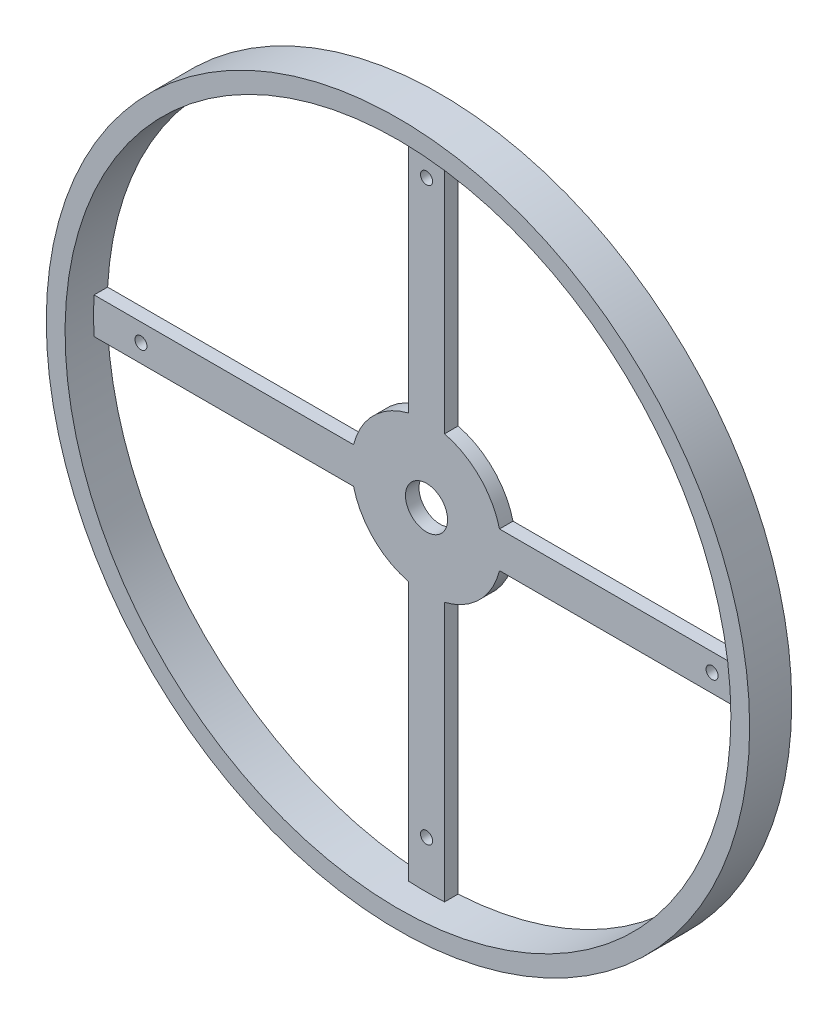
ISO-10303-21;
HEADER;
FILE_DESCRIPTION(('STEP AP214'),'2;1');
FILE_NAME('part.step','',(''),(''),'','','');
FILE_SCHEMA(('AUTOMOTIVE_DESIGN { 1 0 10303 214 1 1 1 1 }'));
ENDSEC;
DATA;
#1=APPLICATION_CONTEXT('core data for automotive mechanical design processes');
#2=APPLICATION_PROTOCOL_DEFINITION('international standard','automotive_design',2000,#1);
#3=PRODUCT_CONTEXT('',#1,'mechanical');
#4=PRODUCT('Part','Part','',(#3));
#5=PRODUCT_RELATED_PRODUCT_CATEGORY('part','',(#4));
#6=PRODUCT_DEFINITION_FORMATION('','',#4);
#7=PRODUCT_DEFINITION_CONTEXT('part definition',#1,'design');
#8=PRODUCT_DEFINITION('design','',#6,#7);
#9=PRODUCT_DEFINITION_SHAPE('','',#8);
#10=(LENGTH_UNIT() NAMED_UNIT(*) SI_UNIT(.MILLI.,.METRE.));
#11=(NAMED_UNIT(*) PLANE_ANGLE_UNIT() SI_UNIT($,.RADIAN.));
#12=(NAMED_UNIT(*) SI_UNIT($,.STERADIAN.) SOLID_ANGLE_UNIT());
#13=UNCERTAINTY_MEASURE_WITH_UNIT(LENGTH_MEASURE(1.E-05),#10,'distance_accuracy_value','');
#14=(GEOMETRIC_REPRESENTATION_CONTEXT(3) GLOBAL_UNCERTAINTY_ASSIGNED_CONTEXT((#13)) GLOBAL_UNIT_ASSIGNED_CONTEXT((#10,
#11,#12)) REPRESENTATION_CONTEXT('',''));
#15=CARTESIAN_POINT('',(0.,0.,0.));
#16=DIRECTION('',(0.,0.,1.));
#17=DIRECTION('',(1.,0.,0.));
#18=AXIS2_PLACEMENT_3D('',#15,#16,#17);
#19=CARTESIAN_POINT('',(0.,0.,1.4));
#20=DIRECTION('',(0.,0.,-1.));
#21=DIRECTION('',(-1.,0.,0.));
#22=AXIS2_PLACEMENT_3D('',#19,#20,#21);
#23=CYLINDRICAL_SURFACE('',#22,11.075);
#24=DIRECTION('',(0.,0.,-1.));
#25=VECTOR('',#24,1.);
#26=CARTESIAN_POINT('',(0.6,11.0587352350981,0.45));
#27=LINE('',#26,#25);
#28=CARTESIAN_POINT('',(0.6,11.0587352350981,0.45));
#29=VERTEX_POINT('',#28);
#30=CARTESIAN_POINT('',(0.6,11.0587352350981,0.));
#31=VERTEX_POINT('',#30);
#32=EDGE_CURVE('E150',#29,#31,#27,.T.);
#33=ORIENTED_EDGE('',*,*,#32,.T.);
#34=CARTESIAN_POINT('',(0.,0.,0.));
#35=DIRECTION('',(0.,0.,1.));
#36=DIRECTION('',(1.,0.,0.));
#37=AXIS2_PLACEMENT_3D('',#34,#35,#36);
#38=CIRCLE('',#37,11.075);
#39=CARTESIAN_POINT('',(11.0587352350981,0.599999999999962,0.));
#40=VERTEX_POINT('',#39);
#41=EDGE_CURVE('E300',#40,#31,#38,.T.);
#42=ORIENTED_EDGE('',*,*,#41,.F.);
#43=DIRECTION('',(0.,0.,-1.));
#44=VECTOR('',#43,1.);
#45=CARTESIAN_POINT('',(11.0587352350981,0.599999999999962,0.45));
#46=LINE('',#45,#44);
#47=CARTESIAN_POINT('',(11.0587352350981,0.599999999999962,0.45));
#48=VERTEX_POINT('',#47);
#49=EDGE_CURVE('E270',#48,#40,#46,.T.);
#50=ORIENTED_EDGE('',*,*,#49,.F.);
#51=CARTESIAN_POINT('',(0.,0.,0.45));
#52=DIRECTION('',(0.,0.,1.));
#53=DIRECTION('',(1.,0.,0.));
#54=AXIS2_PLACEMENT_3D('',#51,#52,#53);
#55=CIRCLE('',#54,11.075);
#56=CARTESIAN_POINT('',(11.0587352350981,-0.600000000000038,0.45));
#57=VERTEX_POINT('',#56);
#58=EDGE_CURVE('E207',#57,#48,#55,.T.);
#59=ORIENTED_EDGE('',*,*,#58,.F.);
#60=DIRECTION('',(0.,0.,-1.));
#61=VECTOR('',#60,1.);
#62=CARTESIAN_POINT('',(11.0587352350981,-0.600000000000038,0.45));
#63=LINE('',#62,#61);
#64=CARTESIAN_POINT('',(11.0587352350981,-0.600000000000038,0.));
#65=VERTEX_POINT('',#64);
#66=EDGE_CURVE('E272',#57,#65,#63,.T.);
#67=ORIENTED_EDGE('',*,*,#66,.T.);
#68=CARTESIAN_POINT('',(0.599999999999923,-11.0587352350981,0.));
#69=VERTEX_POINT('',#68);
#70=EDGE_CURVE('E160',#69,#65,#38,.T.);
#71=ORIENTED_EDGE('',*,*,#70,.F.);
#72=DIRECTION('',(0.,0.,-1.));
#73=VECTOR('',#72,1.);
#74=CARTESIAN_POINT('',(0.599999999999923,-11.0587352350981,0.45));
#75=LINE('',#74,#73);
#76=CARTESIAN_POINT('',(0.599999999999923,-11.0587352350981,0.45));
#77=VERTEX_POINT('',#76);
#78=EDGE_CURVE('E50',#77,#69,#75,.T.);
#79=ORIENTED_EDGE('',*,*,#78,.F.);
#80=CARTESIAN_POINT('',(0.,0.,0.45));
#81=DIRECTION('',(0.,0.,1.));
#82=DIRECTION('',(1.,0.,0.));
#83=AXIS2_PLACEMENT_3D('',#80,#81,#82);
#84=CIRCLE('',#83,11.075);
#85=CARTESIAN_POINT('',(-0.600000000000077,-11.0587352350981,0.45));
#86=VERTEX_POINT('',#85);
#87=EDGE_CURVE('E197',#86,#77,#84,.T.);
#88=ORIENTED_EDGE('',*,*,#87,.F.);
#89=DIRECTION('',(0.,0.,-1.));
#90=VECTOR('',#89,1.);
#91=CARTESIAN_POINT('',(-0.600000000000077,-11.0587352350981,0.45));
#92=LINE('',#91,#90);
#93=CARTESIAN_POINT('',(-0.600000000000077,-11.0587352350981,0.));
#94=VERTEX_POINT('',#93);
#95=EDGE_CURVE('E281',#86,#94,#92,.T.);
#96=ORIENTED_EDGE('',*,*,#95,.T.);
#97=CARTESIAN_POINT('',(-11.0587352350981,-0.599999999999885,0.));
#98=VERTEX_POINT('',#97);
#99=EDGE_CURVE('E306',#98,#94,#38,.T.);
#100=ORIENTED_EDGE('',*,*,#99,.F.);
#101=DIRECTION('',(0.,0.,-1.));
#102=VECTOR('',#101,1.);
#103=CARTESIAN_POINT('',(-11.0587352350981,-0.599999999999885,0.45));
#104=LINE('',#103,#102);
#105=CARTESIAN_POINT('',(-11.0587352350981,-0.599999999999885,0.45));
#106=VERTEX_POINT('',#105);
#107=EDGE_CURVE('E58',#106,#98,#104,.T.);
#108=ORIENTED_EDGE('',*,*,#107,.F.);
#109=CARTESIAN_POINT('',(0.,0.,0.45));
#110=DIRECTION('',(0.,0.,1.));
#111=DIRECTION('',(1.,0.,0.));
#112=AXIS2_PLACEMENT_3D('',#109,#110,#111);
#113=CIRCLE('',#112,11.075);
#114=CARTESIAN_POINT('',(-11.0587352350981,0.600000000000116,0.45));
#115=VERTEX_POINT('',#114);
#116=EDGE_CURVE('E188',#115,#106,#113,.T.);
#117=ORIENTED_EDGE('',*,*,#116,.F.);
#118=DIRECTION('',(0.,0.,-1.));
#119=VECTOR('',#118,1.);
#120=CARTESIAN_POINT('',(-11.0587352350981,0.600000000000116,0.45));
#121=LINE('',#120,#119);
#122=CARTESIAN_POINT('',(-11.0587352350981,0.600000000000116,0.));
#123=VERTEX_POINT('',#122);
#124=EDGE_CURVE('E290',#115,#123,#121,.T.);
#125=ORIENTED_EDGE('',*,*,#124,.T.);
#126=CARTESIAN_POINT('',(-0.6,11.0587352350981,0.));
#127=VERTEX_POINT('',#126);
#128=EDGE_CURVE('E301',#127,#123,#38,.T.);
#129=ORIENTED_EDGE('',*,*,#128,.F.);
#130=DIRECTION('',(0.,0.,-1.));
#131=VECTOR('',#130,1.);
#132=CARTESIAN_POINT('',(-0.6,11.0587352350981,0.45));
#133=LINE('',#132,#131);
#134=CARTESIAN_POINT('',(-0.6,11.0587352350981,0.45));
#135=VERTEX_POINT('',#134);
#136=EDGE_CURVE('E161',#135,#127,#133,.T.);
#137=ORIENTED_EDGE('',*,*,#136,.F.);
#138=CARTESIAN_POINT('',(0.,0.,0.45));
#139=DIRECTION('',(0.,0.,1.));
#140=DIRECTION('',(1.,0.,0.));
#141=AXIS2_PLACEMENT_3D('',#138,#139,#140);
#142=CIRCLE('',#141,11.075);
#143=EDGE_CURVE('E168',#29,#135,#142,.T.);
#144=ORIENTED_EDGE('',*,*,#143,.F.);
#145=EDGE_LOOP('',(#33,#42,#50,#59,#67,#71,#79,#88,#96,#100,#108,#117,#125,#129,#137,#144));
#146=FACE_BOUND('',#145,.T.);
#147=CARTESIAN_POINT('',(0.,0.,1.4));
#148=DIRECTION('',(0.,0.,1.));
#149=DIRECTION('',(1.,0.,0.));
#150=AXIS2_PLACEMENT_3D('',#147,#148,#149);
#151=CIRCLE('',#150,11.075);
#152=CARTESIAN_POINT('',(11.075,0.,1.4));
#153=VERTEX_POINT('',#152);
#154=EDGE_CURVE('E42',#153,#153,#151,.T.);
#155=ORIENTED_EDGE('',*,*,#154,.T.);
#156=EDGE_LOOP('',(#155));
#157=FACE_BOUND('',#156,.T.);
#158=ADVANCED_FACE('F34',(#146,#157),#23,.F.);
#159=CARTESIAN_POINT('',(0.,0.,1.4));
#160=DIRECTION('',(0.,0.,-1.));
#161=DIRECTION('',(-1.,0.,0.));
#162=AXIS2_PLACEMENT_3D('',#159,#160,#161);
#163=CYLINDRICAL_SURFACE('',#162,11.7);
#164=CARTESIAN_POINT('',(0.,0.,1.4));
#165=DIRECTION('',(0.,0.,1.));
#166=DIRECTION('',(1.,0.,0.));
#167=AXIS2_PLACEMENT_3D('',#164,#165,#166);
#168=CIRCLE('',#167,11.7);
#169=CARTESIAN_POINT('',(11.7,0.,1.4));
#170=VERTEX_POINT('',#169);
#171=EDGE_CURVE('E11',#170,#170,#168,.T.);
#172=ORIENTED_EDGE('',*,*,#171,.F.);
#173=EDGE_LOOP('',(#172));
#174=FACE_BOUND('',#173,.T.);
#175=CARTESIAN_POINT('',(0.,0.,0.));
#176=DIRECTION('',(0.,0.,1.));
#177=DIRECTION('',(1.,0.,0.));
#178=AXIS2_PLACEMENT_3D('',#175,#176,#177);
#179=CIRCLE('',#178,11.7);
#180=CARTESIAN_POINT('',(11.7,0.,0.));
#181=VERTEX_POINT('',#180);
#182=EDGE_CURVE('E37',#181,#181,#179,.T.);
#183=ORIENTED_EDGE('',*,*,#182,.T.);
#184=EDGE_LOOP('',(#183));
#185=FACE_BOUND('',#184,.T.);
#186=ADVANCED_FACE('F363',(#174,#185),#163,.T.);
#187=CARTESIAN_POINT('',(0.,0.,1.4));
#188=DIRECTION('',(0.,0.,1.));
#189=DIRECTION('',(1.,0.,0.));
#190=AXIS2_PLACEMENT_3D('',#187,#188,#189);
#191=PLANE('',#190);
#192=ORIENTED_EDGE('',*,*,#154,.F.);
#193=EDGE_LOOP('',(#192));
#194=FACE_BOUND('',#193,.T.);
#195=ORIENTED_EDGE('',*,*,#171,.T.);
#196=EDGE_LOOP('',(#195));
#197=FACE_BOUND('',#196,.T.);
#198=ADVANCED_FACE('F333',(#194,#197),#191,.T.);
#199=CARTESIAN_POINT('',(0.,0.,0.));
#200=DIRECTION('',(0.,0.,1.));
#201=DIRECTION('',(1.,0.,0.));
#202=AXIS2_PLACEMENT_3D('',#199,#200,#201);
#203=PLANE('',#202);
#204=DIRECTION('',(0.,-1.,0.));
#205=VECTOR('',#204,1.);
#206=CARTESIAN_POINT('',(-0.600000000000002,0.,0.));
#207=LINE('',#206,#205);
#208=CARTESIAN_POINT('',(-0.600000000000001,2.42693221990232,0.));
#209=VERTEX_POINT('',#208);
#210=EDGE_CURVE('E229',#127,#209,#207,.T.);
#211=ORIENTED_EDGE('',*,*,#210,.F.);
#212=ORIENTED_EDGE('',*,*,#128,.T.);
#213=DIRECTION('',(1.,0.,0.));
#214=VECTOR('',#213,1.);
#215=CARTESIAN_POINT('',(0.,0.600000000000001,0.));
#216=LINE('',#215,#214);
#217=CARTESIAN_POINT('',(-2.42693221990231,0.600000000000026,0.));
#218=VERTEX_POINT('',#217);
#219=EDGE_CURVE('E235',#123,#218,#216,.T.);
#220=ORIENTED_EDGE('',*,*,#219,.T.);
#221=CARTESIAN_POINT('',(0.,0.,0.));
#222=DIRECTION('',(0.,0.,1.));
#223=DIRECTION('',(1.,0.,0.));
#224=AXIS2_PLACEMENT_3D('',#221,#222,#223);
#225=CIRCLE('',#224,2.5);
#226=EDGE_CURVE('E232',#209,#218,#225,.T.);
#227=ORIENTED_EDGE('',*,*,#226,.F.);
#228=EDGE_LOOP('',(#211,#212,#220,#227));
#229=FACE_BOUND('',#228,.T.);
#230=DIRECTION('',(1.,0.,0.));
#231=VECTOR('',#230,1.);
#232=CARTESIAN_POINT('',(0.,-0.600000000000002,0.));
#233=LINE('',#232,#231);
#234=CARTESIAN_POINT('',(-2.42693221990233,-0.599999999999976,0.));
#235=VERTEX_POINT('',#234);
#236=EDGE_CURVE('E240',#98,#235,#233,.T.);
#237=ORIENTED_EDGE('',*,*,#236,.F.);
#238=ORIENTED_EDGE('',*,*,#99,.T.);
#239=DIRECTION('',(0.,1.,0.));
#240=VECTOR('',#239,1.);
#241=CARTESIAN_POINT('',(-0.600000000000001,0.,0.));
#242=LINE('',#241,#240);
#243=CARTESIAN_POINT('',(-0.600000000000018,-2.42693221990232,0.));
#244=VERTEX_POINT('',#243);
#245=EDGE_CURVE('E242',#94,#244,#242,.T.);
#246=ORIENTED_EDGE('',*,*,#245,.T.);
#247=EDGE_CURVE('E237',#235,#244,#225,.T.);
#248=ORIENTED_EDGE('',*,*,#247,.F.);
#249=EDGE_LOOP('',(#237,#238,#246,#248));
#250=FACE_BOUND('',#249,.T.);
#251=DIRECTION('',(0.,1.,0.));
#252=VECTOR('',#251,1.);
#253=CARTESIAN_POINT('',(0.600000000000002,0.,0.));
#254=LINE('',#253,#252);
#255=CARTESIAN_POINT('',(0.599999999999984,-2.42693221990232,0.));
#256=VERTEX_POINT('',#255);
#257=EDGE_CURVE('E245',#69,#256,#254,.T.);
#258=ORIENTED_EDGE('',*,*,#257,.F.);
#259=ORIENTED_EDGE('',*,*,#70,.T.);
#260=DIRECTION('',(-1.,0.,0.));
#261=VECTOR('',#260,1.);
#262=CARTESIAN_POINT('',(0.,-0.600000000000001,0.));
#263=LINE('',#262,#261);
#264=CARTESIAN_POINT('',(2.42693221990232,-0.600000000000009,0.));
#265=VERTEX_POINT('',#264);
#266=EDGE_CURVE('E248',#65,#265,#263,.T.);
#267=ORIENTED_EDGE('',*,*,#266,.T.);
#268=EDGE_CURVE('E247',#256,#265,#225,.T.);
#269=ORIENTED_EDGE('',*,*,#268,.F.);
#270=EDGE_LOOP('',(#258,#259,#267,#269));
#271=FACE_BOUND('',#270,.T.);
#272=ORIENTED_EDGE('',*,*,#41,.T.);
#273=DIRECTION('',(0.,-1.,0.));
#274=VECTOR('',#273,1.);
#275=CARTESIAN_POINT('',(0.600000000000002,0.,0.));
#276=LINE('',#275,#274);
#277=CARTESIAN_POINT('',(0.600000000000001,2.42693221990232,0.));
#278=VERTEX_POINT('',#277);
#279=EDGE_CURVE('E155',#31,#278,#276,.T.);
#280=ORIENTED_EDGE('',*,*,#279,.T.);
#281=CARTESIAN_POINT('',(2.42693221990232,0.599999999999993,0.));
#282=VERTEX_POINT('',#281);
#283=EDGE_CURVE('E236',#282,#278,#225,.T.);
#284=ORIENTED_EDGE('',*,*,#283,.F.);
#285=DIRECTION('',(-1.,0.,0.));
#286=VECTOR('',#285,1.);
#287=CARTESIAN_POINT('',(0.,0.600000000000002,0.));
#288=LINE('',#287,#286);
#289=EDGE_CURVE('E251',#40,#282,#288,.T.);
#290=ORIENTED_EDGE('',*,*,#289,.F.);
#291=EDGE_LOOP('',(#272,#280,#284,#290));
#292=FACE_BOUND('',#291,.T.);
#293=ORIENTED_EDGE('',*,*,#182,.F.);
#294=EDGE_LOOP('',(#293));
#295=FACE_BOUND('',#294,.T.);
#296=CARTESIAN_POINT('',(0.,9.5,0.));
#297=DIRECTION('',(0.,0.,1.));
#298=DIRECTION('',(1.,0.,0.));
#299=AXIS2_PLACEMENT_3D('',#296,#297,#298);
#300=CIRCLE('',#299,0.2);
#301=CARTESIAN_POINT('',(0.200000000000066,9.5,0.));
#302=VERTEX_POINT('',#301);
#303=EDGE_CURVE('E225',#302,#302,#300,.T.);
#304=ORIENTED_EDGE('',*,*,#303,.T.);
#305=EDGE_LOOP('',(#304));
#306=FACE_BOUND('',#305,.T.);
#307=CARTESIAN_POINT('',(0.,0.,0.));
#308=DIRECTION('',(0.,0.,1.));
#309=DIRECTION('',(1.,0.,0.));
#310=AXIS2_PLACEMENT_3D('',#307,#308,#309);
#311=CIRCLE('',#310,0.7);
#312=CARTESIAN_POINT('',(0.7,0.,0.));
#313=VERTEX_POINT('',#312);
#314=EDGE_CURVE('E254',#313,#313,#311,.T.);
#315=ORIENTED_EDGE('',*,*,#314,.T.);
#316=EDGE_LOOP('',(#315));
#317=FACE_BOUND('',#316,.T.);
#318=CARTESIAN_POINT('',(9.5,0.,0.));
#319=DIRECTION('',(0.,0.,1.));
#320=DIRECTION('',(1.,0.,0.));
#321=AXIS2_PLACEMENT_3D('',#318,#319,#320);
#322=CIRCLE('',#321,0.2);
#323=CARTESIAN_POINT('',(9.7,0.,0.));
#324=VERTEX_POINT('',#323);
#325=EDGE_CURVE('E257',#324,#324,#322,.T.);
#326=ORIENTED_EDGE('',*,*,#325,.T.);
#327=EDGE_LOOP('',(#326));
#328=FACE_BOUND('',#327,.T.);
#329=CARTESIAN_POINT('',(0.,-9.5,0.));
#330=DIRECTION('',(0.,0.,1.));
#331=DIRECTION('',(1.,0.,0.));
#332=AXIS2_PLACEMENT_3D('',#329,#330,#331);
#333=CIRCLE('',#332,0.2);
#334=CARTESIAN_POINT('',(0.2,-9.5,0.));
#335=VERTEX_POINT('',#334);
#336=EDGE_CURVE('E260',#335,#335,#333,.T.);
#337=ORIENTED_EDGE('',*,*,#336,.T.);
#338=EDGE_LOOP('',(#337));
#339=FACE_BOUND('',#338,.T.);
#340=CARTESIAN_POINT('',(-9.5,0.,0.));
#341=DIRECTION('',(0.,0.,1.));
#342=DIRECTION('',(1.,0.,0.));
#343=AXIS2_PLACEMENT_3D('',#340,#341,#342);
#344=CIRCLE('',#343,0.2);
#345=CARTESIAN_POINT('',(-9.3,0.,0.));
#346=VERTEX_POINT('',#345);
#347=EDGE_CURVE('E263',#346,#346,#344,.T.);
#348=ORIENTED_EDGE('',*,*,#347,.T.);
#349=EDGE_LOOP('',(#348));
#350=FACE_BOUND('',#349,.T.);
#351=ADVANCED_FACE('F313',(#229,#250,#271,#292,#295,#306,#317,#328,#339,#350),#203,.F.);
#352=CARTESIAN_POINT('',(0.600000000000002,0.,0.45));
#353=DIRECTION('',(1.,0.,0.));
#354=DIRECTION('',(0.,1.,0.));
#355=AXIS2_PLACEMENT_3D('',#352,#353,#354);
#356=PLANE('',#355);
#357=ORIENTED_EDGE('',*,*,#279,.F.);
#358=ORIENTED_EDGE('',*,*,#32,.F.);
#359=DIRECTION('',(0.,-1.,0.));
#360=VECTOR('',#359,1.);
#361=CARTESIAN_POINT('',(0.600000000000002,0.,0.45));
#362=LINE('',#361,#360);
#363=CARTESIAN_POINT('',(0.600000000000001,2.42693221990232,0.45));
#364=VERTEX_POINT('',#363);
#365=EDGE_CURVE('E153',#29,#364,#362,.T.);
#366=ORIENTED_EDGE('',*,*,#365,.T.);
#367=DIRECTION('',(0.,0.,-1.));
#368=VECTOR('',#367,1.);
#369=CARTESIAN_POINT('',(0.600000000000001,2.42693221990232,0.45));
#370=LINE('',#369,#368);
#371=EDGE_CURVE('E224',#364,#278,#370,.T.);
#372=ORIENTED_EDGE('',*,*,#371,.T.);
#373=EDGE_LOOP('',(#357,#358,#366,#372));
#374=FACE_BOUND('',#373,.T.);
#375=ADVANCED_FACE('F152',(#374),#356,.T.);
#376=CARTESIAN_POINT('',(-0.600000000000002,0.,0.45));
#377=DIRECTION('',(1.,0.,0.));
#378=DIRECTION('',(0.,1.,0.));
#379=AXIS2_PLACEMENT_3D('',#376,#377,#378);
#380=PLANE('',#379);
#381=ORIENTED_EDGE('',*,*,#210,.T.);
#382=DIRECTION('',(0.,0.,-1.));
#383=VECTOR('',#382,1.);
#384=CARTESIAN_POINT('',(-0.600000000000001,2.42693221990232,0.45));
#385=LINE('',#384,#383);
#386=CARTESIAN_POINT('',(-0.600000000000001,2.42693221990232,0.45));
#387=VERTEX_POINT('',#386);
#388=EDGE_CURVE('E295',#387,#209,#385,.T.);
#389=ORIENTED_EDGE('',*,*,#388,.F.);
#390=DIRECTION('',(0.,-1.,0.));
#391=VECTOR('',#390,1.);
#392=CARTESIAN_POINT('',(-0.600000000000002,0.,0.45));
#393=LINE('',#392,#391);
#394=EDGE_CURVE('E177',#135,#387,#393,.T.);
#395=ORIENTED_EDGE('',*,*,#394,.F.);
#396=ORIENTED_EDGE('',*,*,#136,.T.);
#397=EDGE_LOOP('',(#381,#389,#395,#396));
#398=FACE_BOUND('',#397,.T.);
#399=ADVANCED_FACE('F378',(#398),#380,.F.);
#400=CARTESIAN_POINT('',(0.,0.,0.45));
#401=DIRECTION('',(0.,0.,-1.));
#402=DIRECTION('',(-1.,0.,0.));
#403=AXIS2_PLACEMENT_3D('',#400,#401,#402);
#404=CYLINDRICAL_SURFACE('',#403,2.5);
#405=ORIENTED_EDGE('',*,*,#226,.T.);
#406=DIRECTION('',(0.,0.,-1.));
#407=VECTOR('',#406,1.);
#408=CARTESIAN_POINT('',(-2.42693221990231,0.600000000000026,0.45));
#409=LINE('',#408,#407);
#410=CARTESIAN_POINT('',(-2.42693221990231,0.600000000000026,0.45));
#411=VERTEX_POINT('',#410);
#412=EDGE_CURVE('E293',#411,#218,#409,.T.);
#413=ORIENTED_EDGE('',*,*,#412,.F.);
#414=CARTESIAN_POINT('',(0.,0.,0.45));
#415=DIRECTION('',(0.,0.,1.));
#416=DIRECTION('',(1.,0.,0.));
#417=AXIS2_PLACEMENT_3D('',#414,#415,#416);
#418=CIRCLE('',#417,2.5);
#419=EDGE_CURVE('E179',#387,#411,#418,.T.);
#420=ORIENTED_EDGE('',*,*,#419,.F.);
#421=ORIENTED_EDGE('',*,*,#388,.T.);
#422=EDGE_LOOP('',(#405,#413,#420,#421));
#423=FACE_BOUND('',#422,.T.);
#424=ADVANCED_FACE('F381',(#423),#404,.T.);
#425=CARTESIAN_POINT('',(0.,0.600000000000001,0.45));
#426=DIRECTION('',(0.,1.,0.));
#427=DIRECTION('',(-1.,0.,0.));
#428=AXIS2_PLACEMENT_3D('',#425,#426,#427);
#429=PLANE('',#428);
#430=ORIENTED_EDGE('',*,*,#219,.F.);
#431=ORIENTED_EDGE('',*,*,#124,.F.);
#432=DIRECTION('',(1.,0.,0.));
#433=VECTOR('',#432,1.);
#434=CARTESIAN_POINT('',(0.,0.600000000000001,0.45));
#435=LINE('',#434,#433);
#436=EDGE_CURVE('E184',#115,#411,#435,.T.);
#437=ORIENTED_EDGE('',*,*,#436,.T.);
#438=ORIENTED_EDGE('',*,*,#412,.T.);
#439=EDGE_LOOP('',(#430,#431,#437,#438));
#440=FACE_BOUND('',#439,.T.);
#441=ADVANCED_FACE('F383',(#440),#429,.T.);
#442=CARTESIAN_POINT('',(0.,-0.600000000000002,0.45));
#443=DIRECTION('',(0.,1.,0.));
#444=DIRECTION('',(-1.,0.,0.));
#445=AXIS2_PLACEMENT_3D('',#442,#443,#444);
#446=PLANE('',#445);
#447=ORIENTED_EDGE('',*,*,#236,.T.);
#448=DIRECTION('',(0.,0.,-1.));
#449=VECTOR('',#448,1.);
#450=CARTESIAN_POINT('',(-2.42693221990233,-0.599999999999976,0.45));
#451=LINE('',#450,#449);
#452=CARTESIAN_POINT('',(-2.42693221990233,-0.599999999999976,0.45));
#453=VERTEX_POINT('',#452);
#454=EDGE_CURVE('E286',#453,#235,#451,.T.);
#455=ORIENTED_EDGE('',*,*,#454,.F.);
#456=DIRECTION('',(1.,0.,0.));
#457=VECTOR('',#456,1.);
#458=CARTESIAN_POINT('',(0.,-0.600000000000002,0.45));
#459=LINE('',#458,#457);
#460=EDGE_CURVE('E191',#106,#453,#459,.T.);
#461=ORIENTED_EDGE('',*,*,#460,.F.);
#462=ORIENTED_EDGE('',*,*,#107,.T.);
#463=EDGE_LOOP('',(#447,#455,#461,#462));
#464=FACE_BOUND('',#463,.T.);
#465=ADVANCED_FACE('F386',(#464),#446,.F.);
#466=ORIENTED_EDGE('',*,*,#247,.T.);
#467=DIRECTION('',(0.,0.,-1.));
#468=VECTOR('',#467,1.);
#469=CARTESIAN_POINT('',(-0.600000000000018,-2.42693221990232,0.45));
#470=LINE('',#469,#468);
#471=CARTESIAN_POINT('',(-0.600000000000018,-2.42693221990232,0.45));
#472=VERTEX_POINT('',#471);
#473=EDGE_CURVE('E284',#472,#244,#470,.T.);
#474=ORIENTED_EDGE('',*,*,#473,.F.);
#475=EDGE_CURVE('E185',#453,#472,#418,.T.);
#476=ORIENTED_EDGE('',*,*,#475,.F.);
#477=ORIENTED_EDGE('',*,*,#454,.T.);
#478=EDGE_LOOP('',(#466,#474,#476,#477));
#479=FACE_BOUND('',#478,.T.);
#480=ADVANCED_FACE('F323',(#479),#404,.T.);
#481=CARTESIAN_POINT('',(-0.600000000000001,0.,0.45));
#482=DIRECTION('',(-1.,0.,0.));
#483=DIRECTION('',(0.,-1.,0.));
#484=AXIS2_PLACEMENT_3D('',#481,#482,#483);
#485=PLANE('',#484);
#486=ORIENTED_EDGE('',*,*,#245,.F.);
#487=ORIENTED_EDGE('',*,*,#95,.F.);
#488=DIRECTION('',(0.,1.,0.));
#489=VECTOR('',#488,1.);
#490=CARTESIAN_POINT('',(-0.600000000000001,0.,0.45));
#491=LINE('',#490,#489);
#492=EDGE_CURVE('E194',#86,#472,#491,.T.);
#493=ORIENTED_EDGE('',*,*,#492,.T.);
#494=ORIENTED_EDGE('',*,*,#473,.T.);
#495=EDGE_LOOP('',(#486,#487,#493,#494));
#496=FACE_BOUND('',#495,.T.);
#497=ADVANCED_FACE('F318',(#496),#485,.T.);
#498=CARTESIAN_POINT('',(0.600000000000002,0.,0.45));
#499=DIRECTION('',(-1.,0.,0.));
#500=DIRECTION('',(0.,-1.,0.));
#501=AXIS2_PLACEMENT_3D('',#498,#499,#500);
#502=PLANE('',#501);
#503=ORIENTED_EDGE('',*,*,#257,.T.);
#504=DIRECTION('',(0.,0.,-1.));
#505=VECTOR('',#504,1.);
#506=CARTESIAN_POINT('',(0.599999999999984,-2.42693221990232,0.45));
#507=LINE('',#506,#505);
#508=CARTESIAN_POINT('',(0.599999999999984,-2.42693221990232,0.45));
#509=VERTEX_POINT('',#508);
#510=EDGE_CURVE('E277',#509,#256,#507,.T.);
#511=ORIENTED_EDGE('',*,*,#510,.F.);
#512=DIRECTION('',(0.,1.,0.));
#513=VECTOR('',#512,1.);
#514=CARTESIAN_POINT('',(0.600000000000002,0.,0.45));
#515=LINE('',#514,#513);
#516=EDGE_CURVE('E200',#77,#509,#515,.T.);
#517=ORIENTED_EDGE('',*,*,#516,.F.);
#518=ORIENTED_EDGE('',*,*,#78,.T.);
#519=EDGE_LOOP('',(#503,#511,#517,#518));
#520=FACE_BOUND('',#519,.T.);
#521=ADVANCED_FACE('F392',(#520),#502,.F.);
#522=ORIENTED_EDGE('',*,*,#268,.T.);
#523=DIRECTION('',(0.,0.,-1.));
#524=VECTOR('',#523,1.);
#525=CARTESIAN_POINT('',(2.42693221990232,-0.600000000000009,0.45));
#526=LINE('',#525,#524);
#527=CARTESIAN_POINT('',(2.42693221990232,-0.600000000000009,0.45));
#528=VERTEX_POINT('',#527);
#529=EDGE_CURVE('E275',#528,#265,#526,.T.);
#530=ORIENTED_EDGE('',*,*,#529,.F.);
#531=EDGE_CURVE('E203',#509,#528,#418,.T.);
#532=ORIENTED_EDGE('',*,*,#531,.F.);
#533=ORIENTED_EDGE('',*,*,#510,.T.);
#534=EDGE_LOOP('',(#522,#530,#532,#533));
#535=FACE_BOUND('',#534,.T.);
#536=ADVANCED_FACE('F395',(#535),#404,.T.);
#537=CARTESIAN_POINT('',(0.,-0.600000000000001,0.45));
#538=DIRECTION('',(0.,-1.,0.));
#539=DIRECTION('',(1.,0.,0.));
#540=AXIS2_PLACEMENT_3D('',#537,#538,#539);
#541=PLANE('',#540);
#542=ORIENTED_EDGE('',*,*,#266,.F.);
#543=ORIENTED_EDGE('',*,*,#66,.F.);
#544=DIRECTION('',(-1.,0.,0.));
#545=VECTOR('',#544,1.);
#546=CARTESIAN_POINT('',(0.,-0.600000000000001,0.45));
#547=LINE('',#546,#545);
#548=EDGE_CURVE('E204',#57,#528,#547,.T.);
#549=ORIENTED_EDGE('',*,*,#548,.T.);
#550=ORIENTED_EDGE('',*,*,#529,.T.);
#551=EDGE_LOOP('',(#542,#543,#549,#550));
#552=FACE_BOUND('',#551,.T.);
#553=ADVANCED_FACE('F396',(#552),#541,.T.);
#554=CARTESIAN_POINT('',(0.,0.600000000000002,0.45));
#555=DIRECTION('',(0.,-1.,0.));
#556=DIRECTION('',(1.,0.,0.));
#557=AXIS2_PLACEMENT_3D('',#554,#555,#556);
#558=PLANE('',#557);
#559=ORIENTED_EDGE('',*,*,#289,.T.);
#560=DIRECTION('',(0.,0.,-1.));
#561=VECTOR('',#560,1.);
#562=CARTESIAN_POINT('',(2.42693221990232,0.599999999999993,0.45));
#563=LINE('',#562,#561);
#564=CARTESIAN_POINT('',(2.42693221990232,0.599999999999993,0.45));
#565=VERTEX_POINT('',#564);
#566=EDGE_CURVE('E267',#565,#282,#563,.T.);
#567=ORIENTED_EDGE('',*,*,#566,.F.);
#568=DIRECTION('',(-1.,0.,0.));
#569=VECTOR('',#568,1.);
#570=CARTESIAN_POINT('',(0.,0.600000000000002,0.45));
#571=LINE('',#570,#569);
#572=EDGE_CURVE('E210',#48,#565,#571,.T.);
#573=ORIENTED_EDGE('',*,*,#572,.F.);
#574=ORIENTED_EDGE('',*,*,#49,.T.);
#575=EDGE_LOOP('',(#559,#567,#573,#574));
#576=FACE_BOUND('',#575,.T.);
#577=ADVANCED_FACE('F399',(#576),#558,.F.);
#578=CARTESIAN_POINT('',(0.,-9.5,0.45));
#579=DIRECTION('',(0.,0.,-1.));
#580=DIRECTION('',(-1.,0.,0.));
#581=AXIS2_PLACEMENT_3D('',#578,#579,#580);
#582=CYLINDRICAL_SURFACE('',#581,0.2);
#583=CARTESIAN_POINT('',(0.,-9.5,0.45));
#584=DIRECTION('',(0.,0.,1.));
#585=DIRECTION('',(1.,0.,0.));
#586=AXIS2_PLACEMENT_3D('',#583,#584,#585);
#587=CIRCLE('',#586,0.2);
#588=CARTESIAN_POINT('',(0.2,-9.5,0.45));
#589=VERTEX_POINT('',#588);
#590=EDGE_CURVE('E218',#589,#589,#587,.T.);
#591=ORIENTED_EDGE('',*,*,#590,.T.);
#592=EDGE_LOOP('',(#591));
#593=FACE_BOUND('',#592,.T.);
#594=ORIENTED_EDGE('',*,*,#336,.F.);
#595=EDGE_LOOP('',(#594));
#596=FACE_BOUND('',#595,.T.);
#597=ADVANCED_FACE('F403',(#593,#596),#582,.F.);
#598=CARTESIAN_POINT('',(9.5,0.,0.45));
#599=DIRECTION('',(0.,0.,-1.));
#600=DIRECTION('',(-1.,0.,0.));
#601=AXIS2_PLACEMENT_3D('',#598,#599,#600);
#602=CYLINDRICAL_SURFACE('',#601,0.2);
#603=CARTESIAN_POINT('',(9.5,0.,0.45));
#604=DIRECTION('',(0.,0.,1.));
#605=DIRECTION('',(1.,0.,0.));
#606=AXIS2_PLACEMENT_3D('',#603,#604,#605);
#607=CIRCLE('',#606,0.2);
#608=CARTESIAN_POINT('',(9.7,0.,0.45));
#609=VERTEX_POINT('',#608);
#610=EDGE_CURVE('E215',#609,#609,#607,.T.);
#611=ORIENTED_EDGE('',*,*,#610,.T.);
#612=EDGE_LOOP('',(#611));
#613=FACE_BOUND('',#612,.T.);
#614=ORIENTED_EDGE('',*,*,#325,.F.);
#615=EDGE_LOOP('',(#614));
#616=FACE_BOUND('',#615,.T.);
#617=ADVANCED_FACE('F410',(#613,#616),#602,.F.);
#618=CARTESIAN_POINT('',(0.,0.,0.45));
#619=DIRECTION('',(0.,0.,-1.));
#620=DIRECTION('',(-1.,0.,0.));
#621=AXIS2_PLACEMENT_3D('',#618,#619,#620);
#622=CYLINDRICAL_SURFACE('',#621,0.7);
#623=CARTESIAN_POINT('',(0.,0.,0.45));
#624=DIRECTION('',(0.,0.,1.));
#625=DIRECTION('',(1.,0.,0.));
#626=AXIS2_PLACEMENT_3D('',#623,#624,#625);
#627=CIRCLE('',#626,0.7);
#628=CARTESIAN_POINT('',(0.7,0.,0.45));
#629=VERTEX_POINT('',#628);
#630=EDGE_CURVE('E212',#629,#629,#627,.T.);
#631=ORIENTED_EDGE('',*,*,#630,.T.);
#632=EDGE_LOOP('',(#631));
#633=FACE_BOUND('',#632,.T.);
#634=ORIENTED_EDGE('',*,*,#314,.F.);
#635=EDGE_LOOP('',(#634));
#636=FACE_BOUND('',#635,.T.);
#637=ADVANCED_FACE('F407',(#633,#636),#622,.F.);
#638=ORIENTED_EDGE('',*,*,#283,.T.);
#639=ORIENTED_EDGE('',*,*,#371,.F.);
#640=EDGE_CURVE('E171',#565,#364,#418,.T.);
#641=ORIENTED_EDGE('',*,*,#640,.F.);
#642=ORIENTED_EDGE('',*,*,#566,.T.);
#643=EDGE_LOOP('',(#638,#639,#641,#642));
#644=FACE_BOUND('',#643,.T.);
#645=ADVANCED_FACE('F329',(#644),#404,.T.);
#646=CARTESIAN_POINT('',(0.,9.5,0.45));
#647=DIRECTION('',(0.,0.,-1.));
#648=DIRECTION('',(-1.,0.,0.));
#649=AXIS2_PLACEMENT_3D('',#646,#647,#648);
#650=CYLINDRICAL_SURFACE('',#649,0.2);
#651=CARTESIAN_POINT('',(0.,9.5,0.45));
#652=DIRECTION('',(0.,0.,1.));
#653=DIRECTION('',(1.,0.,0.));
#654=AXIS2_PLACEMENT_3D('',#651,#652,#653);
#655=CIRCLE('',#654,0.2);
#656=CARTESIAN_POINT('',(0.200000000000066,9.5,0.45));
#657=VERTEX_POINT('',#656);
#658=EDGE_CURVE('E173',#657,#657,#655,.T.);
#659=ORIENTED_EDGE('',*,*,#658,.T.);
#660=EDGE_LOOP('',(#659));
#661=FACE_BOUND('',#660,.T.);
#662=ORIENTED_EDGE('',*,*,#303,.F.);
#663=EDGE_LOOP('',(#662));
#664=FACE_BOUND('',#663,.T.);
#665=ADVANCED_FACE('F350',(#661,#664),#650,.F.);
#666=CARTESIAN_POINT('',(-9.5,0.,0.45));
#667=DIRECTION('',(0.,0.,-1.));
#668=DIRECTION('',(-1.,0.,0.));
#669=AXIS2_PLACEMENT_3D('',#666,#667,#668);
#670=CYLINDRICAL_SURFACE('',#669,0.2);
#671=CARTESIAN_POINT('',(-9.5,0.,0.45));
#672=DIRECTION('',(0.,0.,1.));
#673=DIRECTION('',(1.,0.,0.));
#674=AXIS2_PLACEMENT_3D('',#671,#672,#673);
#675=CIRCLE('',#674,0.2);
#676=CARTESIAN_POINT('',(-9.3,0.,0.45));
#677=VERTEX_POINT('',#676);
#678=EDGE_CURVE('E221',#677,#677,#675,.T.);
#679=ORIENTED_EDGE('',*,*,#678,.T.);
#680=EDGE_LOOP('',(#679));
#681=FACE_BOUND('',#680,.T.);
#682=ORIENTED_EDGE('',*,*,#347,.F.);
#683=EDGE_LOOP('',(#682));
#684=FACE_BOUND('',#683,.T.);
#685=ADVANCED_FACE('F348',(#681,#684),#670,.F.);
#686=CARTESIAN_POINT('',(0.,0.,0.45));
#687=DIRECTION('',(0.,0.,1.));
#688=DIRECTION('',(1.,0.,0.));
#689=AXIS2_PLACEMENT_3D('',#686,#687,#688);
#690=PLANE('',#689);
#691=ORIENTED_EDGE('',*,*,#658,.F.);
#692=EDGE_LOOP('',(#691));
#693=FACE_BOUND('',#692,.T.);
#694=ORIENTED_EDGE('',*,*,#365,.F.);
#695=ORIENTED_EDGE('',*,*,#143,.T.);
#696=ORIENTED_EDGE('',*,*,#394,.T.);
#697=ORIENTED_EDGE('',*,*,#419,.T.);
#698=ORIENTED_EDGE('',*,*,#436,.F.);
#699=ORIENTED_EDGE('',*,*,#116,.T.);
#700=ORIENTED_EDGE('',*,*,#460,.T.);
#701=ORIENTED_EDGE('',*,*,#475,.T.);
#702=ORIENTED_EDGE('',*,*,#492,.F.);
#703=ORIENTED_EDGE('',*,*,#87,.T.);
#704=ORIENTED_EDGE('',*,*,#516,.T.);
#705=ORIENTED_EDGE('',*,*,#531,.T.);
#706=ORIENTED_EDGE('',*,*,#548,.F.);
#707=ORIENTED_EDGE('',*,*,#58,.T.);
#708=ORIENTED_EDGE('',*,*,#572,.T.);
#709=ORIENTED_EDGE('',*,*,#640,.T.);
#710=EDGE_LOOP('',(#694,#695,#696,#697,#698,#699,#700,#701,#702,#703,#704,#705,#706,#707,#708,#709));
#711=FACE_BOUND('',#710,.T.);
#712=ORIENTED_EDGE('',*,*,#630,.F.);
#713=EDGE_LOOP('',(#712));
#714=FACE_BOUND('',#713,.T.);
#715=ORIENTED_EDGE('',*,*,#610,.F.);
#716=EDGE_LOOP('',(#715));
#717=FACE_BOUND('',#716,.T.);
#718=ORIENTED_EDGE('',*,*,#590,.F.);
#719=EDGE_LOOP('',(#718));
#720=FACE_BOUND('',#719,.T.);
#721=ORIENTED_EDGE('',*,*,#678,.F.);
#722=EDGE_LOOP('',(#721));
#723=FACE_BOUND('',#722,.T.);
#724=ADVANCED_FACE('F165',(#693,#711,#714,#717,#720,#723),#690,.T.);
#725=CLOSED_SHELL('',(#158,#186,#198,#351,#375,#399,#424,#441,#465,#480,#497,#521,#536,#553,
#577,#597,#617,#637,#645,#665,#685,#724));
#726=MANIFOLD_SOLID_BREP('B2',#725);
#727=ADVANCED_BREP_SHAPE_REPRESENTATION('',(#18,#726),#14);
#728=SHAPE_DEFINITION_REPRESENTATION(#9,#727);
ENDSEC;
END-ISO-10303-21;
